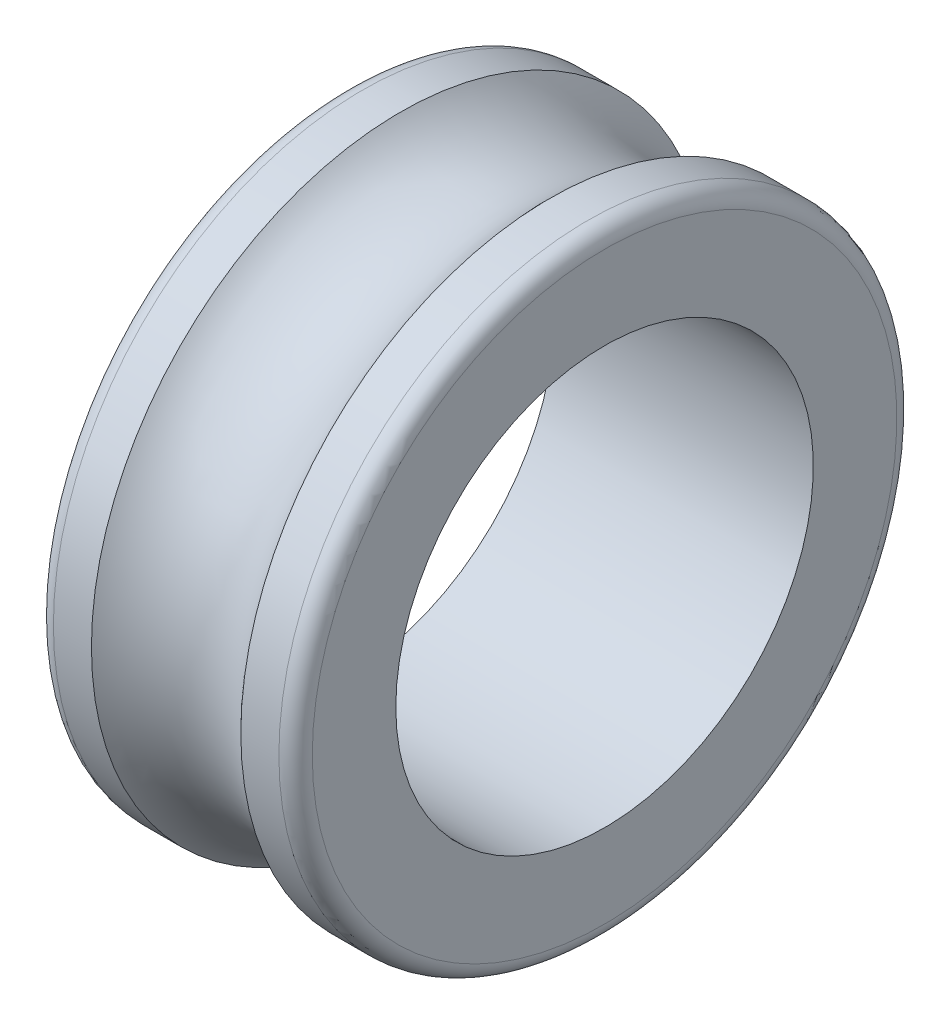
ISO-10303-21;
HEADER;
FILE_DESCRIPTION(('STEP AP214'),'2;1');
FILE_NAME('part.step','',(''),(''),'','','');
FILE_SCHEMA(('AUTOMOTIVE_DESIGN { 1 0 10303 214 1 1 1 1 }'));
ENDSEC;
DATA;
#1=APPLICATION_CONTEXT('core data for automotive mechanical design processes');
#2=APPLICATION_PROTOCOL_DEFINITION('international standard','automotive_design',2000,#1);
#3=PRODUCT_CONTEXT('',#1,'mechanical');
#4=PRODUCT('Part','Part','',(#3));
#5=PRODUCT_RELATED_PRODUCT_CATEGORY('part','',(#4));
#6=PRODUCT_DEFINITION_FORMATION('','',#4);
#7=PRODUCT_DEFINITION_CONTEXT('part definition',#1,'design');
#8=PRODUCT_DEFINITION('design','',#6,#7);
#9=PRODUCT_DEFINITION_SHAPE('','',#8);
#10=(LENGTH_UNIT() NAMED_UNIT(*) SI_UNIT(.MILLI.,.METRE.));
#11=(NAMED_UNIT(*) PLANE_ANGLE_UNIT() SI_UNIT($,.RADIAN.));
#12=(NAMED_UNIT(*) SI_UNIT($,.STERADIAN.) SOLID_ANGLE_UNIT());
#13=UNCERTAINTY_MEASURE_WITH_UNIT(LENGTH_MEASURE(1.E-05),#10,'distance_accuracy_value','');
#14=(GEOMETRIC_REPRESENTATION_CONTEXT(3) GLOBAL_UNCERTAINTY_ASSIGNED_CONTEXT((#13)) GLOBAL_UNIT_ASSIGNED_CONTEXT((#10,
#11,#12)) REPRESENTATION_CONTEXT('',''));
#15=CARTESIAN_POINT('',(0.,0.,0.));
#16=DIRECTION('',(0.,0.,1.));
#17=DIRECTION('',(1.,0.,0.));
#18=AXIS2_PLACEMENT_3D('',#15,#16,#17);
#19=CARTESIAN_POINT('',(15.5,35.,0.));
#20=DIRECTION('',(-1.,0.,0.));
#21=DIRECTION('',(0.,0.,1.));
#22=AXIS2_PLACEMENT_3D('',#19,#20,#21);
#23=PLANE('',#22);
#24=CARTESIAN_POINT('',(15.5,0.,0.));
#25=DIRECTION('',(-1.,0.,0.));
#26=DIRECTION('',(0.,0.,1.));
#27=AXIS2_PLACEMENT_3D('',#24,#25,#26);
#28=CIRCLE('',#27,35.);
#29=CARTESIAN_POINT('',(15.5,0.,35.));
#30=VERTEX_POINT('',#29);
#31=EDGE_CURVE('E10',#30,#30,#28,.T.);
#32=ORIENTED_EDGE('',*,*,#31,.F.);
#33=EDGE_LOOP('',(#32));
#34=FACE_BOUND('',#33,.T.);
#35=CARTESIAN_POINT('',(15.5,0.,0.));
#36=DIRECTION('',(-1.,0.,0.));
#37=DIRECTION('',(0.,0.,1.));
#38=AXIS2_PLACEMENT_3D('',#35,#36,#37);
#39=CIRCLE('',#38,25.);
#40=CARTESIAN_POINT('',(15.5,0.,25.));
#41=VERTEX_POINT('',#40);
#42=EDGE_CURVE('E59',#41,#41,#39,.T.);
#43=ORIENTED_EDGE('',*,*,#42,.T.);
#44=EDGE_LOOP('',(#43));
#45=FACE_BOUND('',#44,.T.);
#46=ADVANCED_FACE('F31',(#34,#45),#23,.F.);
#47=CARTESIAN_POINT('',(13.5,0.,0.));
#48=DIRECTION('',(-1.,0.,0.));
#49=DIRECTION('',(0.,0.,1.));
#50=AXIS2_PLACEMENT_3D('',#47,#48,#49);
#51=TOROIDAL_SURFACE('',#50,35.,2.);
#52=CARTESIAN_POINT('',(13.5,0.,0.));
#53=DIRECTION('',(-1.,0.,0.));
#54=DIRECTION('',(0.,0.,1.));
#55=AXIS2_PLACEMENT_3D('',#52,#53,#54);
#56=CIRCLE('',#55,37.);
#57=CARTESIAN_POINT('',(13.5,0.,37.));
#58=VERTEX_POINT('',#57);
#59=EDGE_CURVE('E37',#58,#58,#56,.T.);
#60=ORIENTED_EDGE('',*,*,#59,.F.);
#61=EDGE_LOOP('',(#60));
#62=FACE_BOUND('',#61,.T.);
#63=ORIENTED_EDGE('',*,*,#31,.T.);
#64=EDGE_LOOP('',(#63));
#65=FACE_BOUND('',#64,.T.);
#66=ADVANCED_FACE('F96',(#62,#65),#51,.T.);
#67=CARTESIAN_POINT('',(0.,0.,0.));
#68=DIRECTION('',(-1.,0.,0.));
#69=DIRECTION('',(0.,0.,1.));
#70=AXIS2_PLACEMENT_3D('',#67,#68,#69);
#71=CYLINDRICAL_SURFACE('',#70,37.);
#72=CARTESIAN_POINT('',(8.94427190999916,0.,0.));
#73=DIRECTION('',(-1.,0.,0.));
#74=DIRECTION('',(0.,0.,1.));
#75=AXIS2_PLACEMENT_3D('',#72,#73,#74);
#76=CIRCLE('',#75,37.);
#77=CARTESIAN_POINT('',(8.94427190999916,0.,37.));
#78=VERTEX_POINT('',#77);
#79=EDGE_CURVE('E41',#78,#78,#76,.T.);
#80=ORIENTED_EDGE('',*,*,#79,.F.);
#81=EDGE_LOOP('',(#80));
#82=FACE_BOUND('',#81,.T.);
#83=ORIENTED_EDGE('',*,*,#59,.T.);
#84=EDGE_LOOP('',(#83));
#85=FACE_BOUND('',#84,.T.);
#86=ADVANCED_FACE('F91',(#82,#85),#71,.T.);
#87=CARTESIAN_POINT('',(0.,0.,0.));
#88=DIRECTION('',(-1.,0.,0.));
#89=DIRECTION('',(0.,0.,1.));
#90=AXIS2_PLACEMENT_3D('',#87,#88,#89);
#91=TOROIDAL_SURFACE('',#90,45.,12.);
#92=CARTESIAN_POINT('',(-8.94427190999916,0.,0.));
#93=DIRECTION('',(-1.,0.,0.));
#94=DIRECTION('',(0.,0.,1.));
#95=AXIS2_PLACEMENT_3D('',#92,#93,#94);
#96=CIRCLE('',#95,37.);
#97=CARTESIAN_POINT('',(-8.94427190999916,0.,37.));
#98=VERTEX_POINT('',#97);
#99=EDGE_CURVE('E45',#98,#98,#96,.T.);
#100=ORIENTED_EDGE('',*,*,#99,.F.);
#101=EDGE_LOOP('',(#100));
#102=FACE_BOUND('',#101,.T.);
#103=ORIENTED_EDGE('',*,*,#79,.T.);
#104=EDGE_LOOP('',(#103));
#105=FACE_BOUND('',#104,.T.);
#106=ADVANCED_FACE('F85',(#102,#105),#91,.F.);
#107=CARTESIAN_POINT('',(0.,0.,0.));
#108=DIRECTION('',(-1.,0.,0.));
#109=DIRECTION('',(0.,0.,1.));
#110=AXIS2_PLACEMENT_3D('',#107,#108,#109);
#111=CYLINDRICAL_SURFACE('',#110,37.);
#112=CARTESIAN_POINT('',(-13.5,0.,0.));
#113=DIRECTION('',(-1.,0.,0.));
#114=DIRECTION('',(0.,0.,1.));
#115=AXIS2_PLACEMENT_3D('',#112,#113,#114);
#116=CIRCLE('',#115,37.);
#117=CARTESIAN_POINT('',(-13.5,0.,37.));
#118=VERTEX_POINT('',#117);
#119=EDGE_CURVE('E50',#118,#118,#116,.T.);
#120=ORIENTED_EDGE('',*,*,#119,.F.);
#121=EDGE_LOOP('',(#120));
#122=FACE_BOUND('',#121,.T.);
#123=ORIENTED_EDGE('',*,*,#99,.T.);
#124=EDGE_LOOP('',(#123));
#125=FACE_BOUND('',#124,.T.);
#126=ADVANCED_FACE('F79',(#122,#125),#111,.T.);
#127=CARTESIAN_POINT('',(-13.5,0.,0.));
#128=DIRECTION('',(-1.,0.,0.));
#129=DIRECTION('',(0.,0.,1.));
#130=AXIS2_PLACEMENT_3D('',#127,#128,#129);
#131=TOROIDAL_SURFACE('',#130,35.,2.);
#132=CARTESIAN_POINT('',(-15.5,0.,0.));
#133=DIRECTION('',(-1.,0.,0.));
#134=DIRECTION('',(0.,0.,1.));
#135=AXIS2_PLACEMENT_3D('',#132,#133,#134);
#136=CIRCLE('',#135,35.);
#137=CARTESIAN_POINT('',(-15.5,0.,35.));
#138=VERTEX_POINT('',#137);
#139=EDGE_CURVE('E53',#138,#138,#136,.T.);
#140=ORIENTED_EDGE('',*,*,#139,.F.);
#141=EDGE_LOOP('',(#140));
#142=FACE_BOUND('',#141,.T.);
#143=ORIENTED_EDGE('',*,*,#119,.T.);
#144=EDGE_LOOP('',(#143));
#145=FACE_BOUND('',#144,.T.);
#146=ADVANCED_FACE('F73',(#142,#145),#131,.T.);
#147=CARTESIAN_POINT('',(-15.5,35.,0.));
#148=DIRECTION('',(1.,0.,0.));
#149=DIRECTION('',(0.,0.,-1.));
#150=AXIS2_PLACEMENT_3D('',#147,#148,#149);
#151=PLANE('',#150);
#152=CARTESIAN_POINT('',(-15.5,0.,0.));
#153=DIRECTION('',(-1.,0.,0.));
#154=DIRECTION('',(0.,0.,1.));
#155=AXIS2_PLACEMENT_3D('',#152,#153,#154);
#156=CIRCLE('',#155,25.);
#157=CARTESIAN_POINT('',(-15.5,0.,25.));
#158=VERTEX_POINT('',#157);
#159=EDGE_CURVE('E56',#158,#158,#156,.T.);
#160=ORIENTED_EDGE('',*,*,#159,.F.);
#161=EDGE_LOOP('',(#160));
#162=FACE_BOUND('',#161,.T.);
#163=ORIENTED_EDGE('',*,*,#139,.T.);
#164=EDGE_LOOP('',(#163));
#165=FACE_BOUND('',#164,.T.);
#166=ADVANCED_FACE('F67',(#162,#165),#151,.F.);
#167=CARTESIAN_POINT('',(0.,0.,0.));
#168=DIRECTION('',(-1.,0.,0.));
#169=DIRECTION('',(0.,0.,1.));
#170=AXIS2_PLACEMENT_3D('',#167,#168,#169);
#171=CYLINDRICAL_SURFACE('',#170,25.);
#172=ORIENTED_EDGE('',*,*,#42,.F.);
#173=EDGE_LOOP('',(#172));
#174=FACE_BOUND('',#173,.T.);
#175=ORIENTED_EDGE('',*,*,#159,.T.);
#176=EDGE_LOOP('',(#175));
#177=FACE_BOUND('',#176,.T.);
#178=ADVANCED_FACE('F64',(#174,#177),#171,.F.);
#179=CLOSED_SHELL('',(#46,#66,#86,#106,#126,#146,#166,#178));
#180=MANIFOLD_SOLID_BREP('B2',#179);
#181=ADVANCED_BREP_SHAPE_REPRESENTATION('',(#18,#180),#14);
#182=SHAPE_DEFINITION_REPRESENTATION(#9,#181);
ENDSEC;
END-ISO-10303-21;
